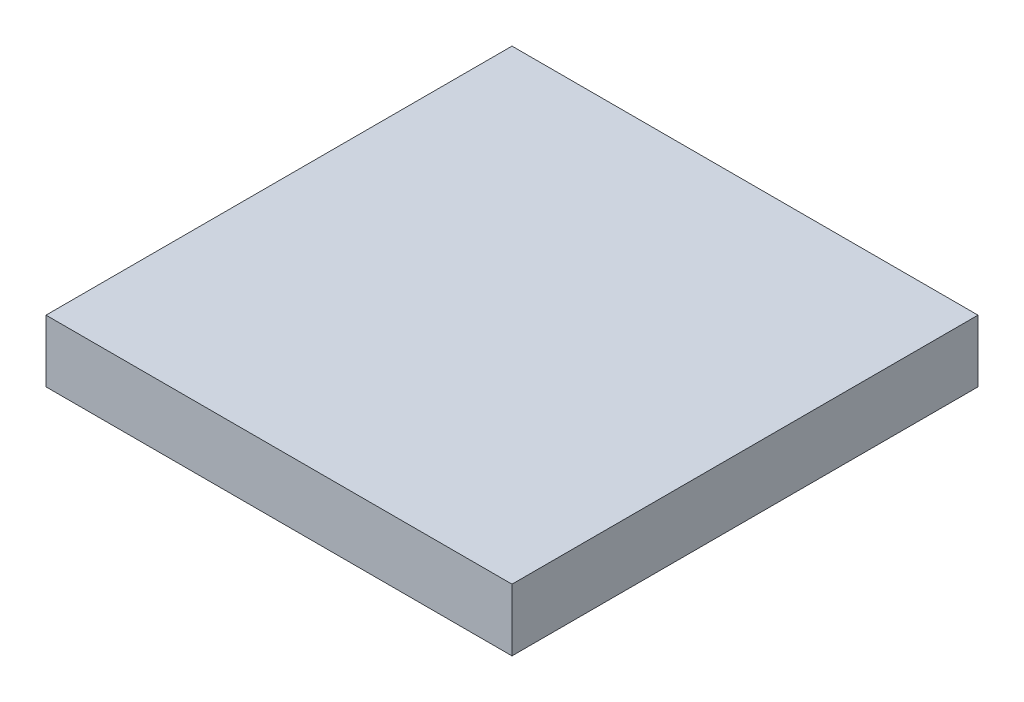
ISO-10303-21;
HEADER;
FILE_DESCRIPTION(('STEP AP214'),'2;1');
FILE_NAME('part.step','',(''),(''),'','','');
FILE_SCHEMA(('AUTOMOTIVE_DESIGN { 1 0 10303 214 1 1 1 1 }'));
ENDSEC;
DATA;
#1=APPLICATION_CONTEXT('core data for automotive mechanical design processes');
#2=APPLICATION_PROTOCOL_DEFINITION('international standard','automotive_design',2000,#1);
#3=PRODUCT_CONTEXT('',#1,'mechanical');
#4=PRODUCT('Part','Part','',(#3));
#5=PRODUCT_RELATED_PRODUCT_CATEGORY('part','',(#4));
#6=PRODUCT_DEFINITION_FORMATION('','',#4);
#7=PRODUCT_DEFINITION_CONTEXT('part definition',#1,'design');
#8=PRODUCT_DEFINITION('design','',#6,#7);
#9=PRODUCT_DEFINITION_SHAPE('','',#8);
#10=(LENGTH_UNIT() NAMED_UNIT(*) SI_UNIT(.MILLI.,.METRE.));
#11=(NAMED_UNIT(*) PLANE_ANGLE_UNIT() SI_UNIT($,.RADIAN.));
#12=(NAMED_UNIT(*) SI_UNIT($,.STERADIAN.) SOLID_ANGLE_UNIT());
#13=UNCERTAINTY_MEASURE_WITH_UNIT(LENGTH_MEASURE(1.E-05),#10,'distance_accuracy_value','');
#14=(GEOMETRIC_REPRESENTATION_CONTEXT(3) GLOBAL_UNCERTAINTY_ASSIGNED_CONTEXT((#13)) GLOBAL_UNIT_ASSIGNED_CONTEXT((#10,
#11,#12)) REPRESENTATION_CONTEXT('',''));
#15=CARTESIAN_POINT('',(0.,0.,0.));
#16=DIRECTION('',(0.,0.,1.));
#17=DIRECTION('',(1.,0.,0.));
#18=AXIS2_PLACEMENT_3D('',#15,#16,#17);
#19=CARTESIAN_POINT('',(-25.5294117647059,2.,-13.4509803921569));
#20=DIRECTION('',(1.,0.,0.));
#21=DIRECTION('',(0.,0.,-1.));
#22=AXIS2_PLACEMENT_3D('',#19,#20,#21);
#23=PLANE('',#22);
#24=DIRECTION('',(0.,0.,1.));
#25=VECTOR('',#24,1.);
#26=CARTESIAN_POINT('',(-25.5294117647059,0.,-13.4509803921569));
#27=LINE('',#26,#25);
#28=CARTESIAN_POINT('',(-25.5294117647059,0.,-13.4509803921569));
#29=VERTEX_POINT('',#28);
#30=CARTESIAN_POINT('',(-25.5294117647059,0.,1.54901960784314));
#31=VERTEX_POINT('',#30);
#32=EDGE_CURVE('E96',#29,#31,#27,.T.);
#33=ORIENTED_EDGE('',*,*,#32,.T.);
#34=DIRECTION('',(0.,-1.,0.));
#35=VECTOR('',#34,1.);
#36=CARTESIAN_POINT('',(-25.5294117647059,2.,1.54901960784314));
#37=LINE('',#36,#35);
#38=CARTESIAN_POINT('',(-25.5294117647059,2.,1.54901960784314));
#39=VERTEX_POINT('',#38);
#40=EDGE_CURVE('E11',#39,#31,#37,.T.);
#41=ORIENTED_EDGE('',*,*,#40,.F.);
#42=DIRECTION('',(0.,0.,1.));
#43=VECTOR('',#42,1.);
#44=CARTESIAN_POINT('',(-25.5294117647059,2.,-13.4509803921569));
#45=LINE('',#44,#43);
#46=CARTESIAN_POINT('',(-25.5294117647059,2.,-13.4509803921569));
#47=VERTEX_POINT('',#46);
#48=EDGE_CURVE('E84',#47,#39,#45,.T.);
#49=ORIENTED_EDGE('',*,*,#48,.F.);
#50=DIRECTION('',(0.,-1.,0.));
#51=VECTOR('',#50,1.);
#52=CARTESIAN_POINT('',(-25.5294117647059,2.,-13.4509803921569));
#53=LINE('',#52,#51);
#54=EDGE_CURVE('E92',#47,#29,#53,.T.);
#55=ORIENTED_EDGE('',*,*,#54,.T.);
#56=EDGE_LOOP('',(#33,#41,#49,#55));
#57=FACE_BOUND('',#56,.T.);
#58=ADVANCED_FACE('F33',(#57),#23,.F.);
#59=CARTESIAN_POINT('',(-25.5294117647059,2.,1.54901960784314));
#60=DIRECTION('',(0.,0.,-1.));
#61=DIRECTION('',(-1.,0.,0.));
#62=AXIS2_PLACEMENT_3D('',#59,#60,#61);
#63=PLANE('',#62);
#64=DIRECTION('',(1.,0.,0.));
#65=VECTOR('',#64,1.);
#66=CARTESIAN_POINT('',(-25.5294117647059,0.,1.54901960784314));
#67=LINE('',#66,#65);
#68=CARTESIAN_POINT('',(-10.5294117647059,0.,1.54901960784314));
#69=VERTEX_POINT('',#68);
#70=EDGE_CURVE('E88',#31,#69,#67,.T.);
#71=ORIENTED_EDGE('',*,*,#70,.T.);
#72=DIRECTION('',(0.,-1.,0.));
#73=VECTOR('',#72,1.);
#74=CARTESIAN_POINT('',(-10.5294117647059,2.,1.54901960784314));
#75=LINE('',#74,#73);
#76=CARTESIAN_POINT('',(-10.5294117647059,2.,1.54901960784314));
#77=VERTEX_POINT('',#76);
#78=EDGE_CURVE('E41',#77,#69,#75,.T.);
#79=ORIENTED_EDGE('',*,*,#78,.F.);
#80=DIRECTION('',(1.,0.,0.));
#81=VECTOR('',#80,1.);
#82=CARTESIAN_POINT('',(-25.5294117647059,2.,1.54901960784314));
#83=LINE('',#82,#81);
#84=EDGE_CURVE('E79',#39,#77,#83,.T.);
#85=ORIENTED_EDGE('',*,*,#84,.F.);
#86=ORIENTED_EDGE('',*,*,#40,.T.);
#87=EDGE_LOOP('',(#71,#79,#85,#86));
#88=FACE_BOUND('',#87,.T.);
#89=ADVANCED_FACE('F87',(#88),#63,.F.);
#90=CARTESIAN_POINT('',(-10.5294117647059,2.,-13.4509803921569));
#91=DIRECTION('',(-1.,0.,0.));
#92=DIRECTION('',(0.,0.,1.));
#93=AXIS2_PLACEMENT_3D('',#90,#91,#92);
#94=PLANE('',#93);
#95=DIRECTION('',(0.,0.,-1.));
#96=VECTOR('',#95,1.);
#97=CARTESIAN_POINT('',(-10.5294117647059,0.,-13.4509803921569));
#98=LINE('',#97,#96);
#99=CARTESIAN_POINT('',(-10.5294117647059,0.,-13.4509803921569));
#100=VERTEX_POINT('',#99);
#101=EDGE_CURVE('E66',#69,#100,#98,.T.);
#102=ORIENTED_EDGE('',*,*,#101,.T.);
#103=DIRECTION('',(0.,-1.,0.));
#104=VECTOR('',#103,1.);
#105=CARTESIAN_POINT('',(-10.5294117647059,2.,-13.4509803921569));
#106=LINE('',#105,#104);
#107=CARTESIAN_POINT('',(-10.5294117647059,2.,-13.4509803921569));
#108=VERTEX_POINT('',#107);
#109=EDGE_CURVE('E89',#108,#100,#106,.T.);
#110=ORIENTED_EDGE('',*,*,#109,.F.);
#111=DIRECTION('',(0.,0.,-1.));
#112=VECTOR('',#111,1.);
#113=CARTESIAN_POINT('',(-10.5294117647059,2.,-13.4509803921569));
#114=LINE('',#113,#112);
#115=EDGE_CURVE('E82',#77,#108,#114,.T.);
#116=ORIENTED_EDGE('',*,*,#115,.F.);
#117=ORIENTED_EDGE('',*,*,#78,.T.);
#118=EDGE_LOOP('',(#102,#110,#116,#117));
#119=FACE_BOUND('',#118,.T.);
#120=ADVANCED_FACE('F90',(#119),#94,.F.);
#121=CARTESIAN_POINT('',(-25.5294117647059,2.,-13.4509803921569));
#122=DIRECTION('',(0.,0.,1.));
#123=DIRECTION('',(1.,0.,0.));
#124=AXIS2_PLACEMENT_3D('',#121,#122,#123);
#125=PLANE('',#124);
#126=DIRECTION('',(-1.,0.,0.));
#127=VECTOR('',#126,1.);
#128=CARTESIAN_POINT('',(-25.5294117647059,0.,-13.4509803921569));
#129=LINE('',#128,#127);
#130=EDGE_CURVE('E72',#100,#29,#129,.T.);
#131=ORIENTED_EDGE('',*,*,#130,.T.);
#132=ORIENTED_EDGE('',*,*,#54,.F.);
#133=DIRECTION('',(-1.,0.,0.));
#134=VECTOR('',#133,1.);
#135=CARTESIAN_POINT('',(-25.5294117647059,2.,-13.4509803921569));
#136=LINE('',#135,#134);
#137=EDGE_CURVE('E49',#108,#47,#136,.T.);
#138=ORIENTED_EDGE('',*,*,#137,.F.);
#139=ORIENTED_EDGE('',*,*,#109,.T.);
#140=EDGE_LOOP('',(#131,#132,#138,#139));
#141=FACE_BOUND('',#140,.T.);
#142=ADVANCED_FACE('F103',(#141),#125,.F.);
#143=CARTESIAN_POINT('',(0.,2.,0.));
#144=DIRECTION('',(0.,1.,0.));
#145=DIRECTION('',(0.,0.,1.));
#146=AXIS2_PLACEMENT_3D('',#143,#144,#145);
#147=PLANE('',#146);
#148=ORIENTED_EDGE('',*,*,#48,.T.);
#149=ORIENTED_EDGE('',*,*,#84,.T.);
#150=ORIENTED_EDGE('',*,*,#115,.T.);
#151=ORIENTED_EDGE('',*,*,#137,.T.);
#152=EDGE_LOOP('',(#148,#149,#150,#151));
#153=FACE_BOUND('',#152,.T.);
#154=ADVANCED_FACE('F80',(#153),#147,.T.);
#155=CARTESIAN_POINT('',(0.,0.,0.));
#156=DIRECTION('',(0.,1.,0.));
#157=DIRECTION('',(0.,0.,1.));
#158=AXIS2_PLACEMENT_3D('',#155,#156,#157);
#159=PLANE('',#158);
#160=ORIENTED_EDGE('',*,*,#32,.F.);
#161=ORIENTED_EDGE('',*,*,#130,.F.);
#162=ORIENTED_EDGE('',*,*,#101,.F.);
#163=ORIENTED_EDGE('',*,*,#70,.F.);
#164=EDGE_LOOP('',(#160,#161,#162,#163));
#165=FACE_BOUND('',#164,.T.);
#166=ADVANCED_FACE('F106',(#165),#159,.F.);
#167=CLOSED_SHELL('',(#58,#89,#120,#142,#154,#166));
#168=MANIFOLD_SOLID_BREP('B2',#167);
#169=ADVANCED_BREP_SHAPE_REPRESENTATION('',(#18,#168),#14);
#170=SHAPE_DEFINITION_REPRESENTATION(#9,#169);
ENDSEC;
END-ISO-10303-21;
